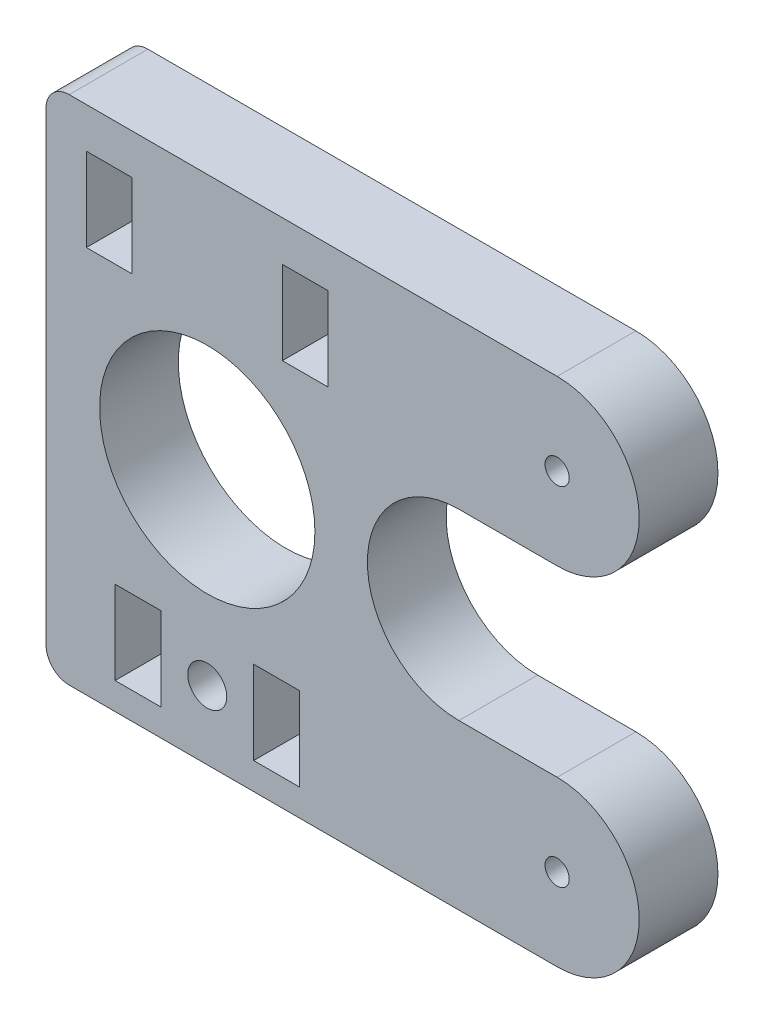
ISO-10303-21;
HEADER;
FILE_DESCRIPTION(('STEP AP214'),'2;1');
FILE_NAME('part.step','',(''),(''),'','','');
FILE_SCHEMA(('AUTOMOTIVE_DESIGN { 1 0 10303 214 1 1 1 1 }'));
ENDSEC;
DATA;
#1=APPLICATION_CONTEXT('core data for automotive mechanical design processes');
#2=APPLICATION_PROTOCOL_DEFINITION('international standard','automotive_design',2000,#1);
#3=PRODUCT_CONTEXT('',#1,'mechanical');
#4=PRODUCT('Part','Part','',(#3));
#5=PRODUCT_RELATED_PRODUCT_CATEGORY('part','',(#4));
#6=PRODUCT_DEFINITION_FORMATION('','',#4);
#7=PRODUCT_DEFINITION_CONTEXT('part definition',#1,'design');
#8=PRODUCT_DEFINITION('design','',#6,#7);
#9=PRODUCT_DEFINITION_SHAPE('','',#8);
#10=(LENGTH_UNIT() NAMED_UNIT(*) SI_UNIT(.MILLI.,.METRE.));
#11=(NAMED_UNIT(*) PLANE_ANGLE_UNIT() SI_UNIT($,.RADIAN.));
#12=(NAMED_UNIT(*) SI_UNIT($,.STERADIAN.) SOLID_ANGLE_UNIT());
#13=UNCERTAINTY_MEASURE_WITH_UNIT(LENGTH_MEASURE(1.E-05),#10,'distance_accuracy_value','');
#14=(GEOMETRIC_REPRESENTATION_CONTEXT(3) GLOBAL_UNCERTAINTY_ASSIGNED_CONTEXT((#13)) GLOBAL_UNIT_ASSIGNED_CONTEXT((#10,
#11,#12)) REPRESENTATION_CONTEXT('',''));
#15=CARTESIAN_POINT('',(0.,0.,0.));
#16=DIRECTION('',(0.,0.,1.));
#17=DIRECTION('',(1.,0.,0.));
#18=AXIS2_PLACEMENT_3D('',#15,#16,#17);
#19=CARTESIAN_POINT('',(684.72652137136,317.86545660983,5.85));
#20=DIRECTION('',(0.,0.,1.));
#21=DIRECTION('',(1.,0.,0.));
#22=AXIS2_PLACEMENT_3D('',#19,#20,#21);
#23=PLANE('',#22);
#24=DIRECTION('',(0.,1.,0.));
#25=VECTOR('',#24,1.);
#26=CARTESIAN_POINT('',(667.706532371359,340.56545660983,5.85));
#27=LINE('',#26,#25);
#28=CARTESIAN_POINT('',(667.706532371359,340.56545660983,5.85));
#29=VERTEX_POINT('',#28);
#30=CARTESIAN_POINT('',(667.706532371359,346.76545660983,5.85));
#31=VERTEX_POINT('',#30);
#32=EDGE_CURVE('E244',#29,#31,#27,.T.);
#33=ORIENTED_EDGE('',*,*,#32,.F.);
#34=DIRECTION('',(1.,0.,0.));
#35=VECTOR('',#34,1.);
#36=CARTESIAN_POINT('',(664.306521371359,340.56545660983,5.85));
#37=LINE('',#36,#35);
#38=CARTESIAN_POINT('',(664.306521371359,340.56545660983,5.85));
#39=VERTEX_POINT('',#38);
#40=EDGE_CURVE('E242',#39,#29,#37,.T.);
#41=ORIENTED_EDGE('',*,*,#40,.F.);
#42=DIRECTION('',(0.,-1.,0.));
#43=VECTOR('',#42,1.);
#44=CARTESIAN_POINT('',(664.306521371359,346.76545660983,5.85));
#45=LINE('',#44,#43);
#46=CARTESIAN_POINT('',(664.306521371359,346.76545660983,5.85));
#47=VERTEX_POINT('',#46);
#48=EDGE_CURVE('E250',#47,#39,#45,.T.);
#49=ORIENTED_EDGE('',*,*,#48,.F.);
#50=DIRECTION('',(-1.,0.,0.));
#51=VECTOR('',#50,1.);
#52=CARTESIAN_POINT('',(667.706532371359,346.76545660983,5.85));
#53=LINE('',#52,#51);
#54=EDGE_CURVE('E247',#31,#47,#53,.T.);
#55=ORIENTED_EDGE('',*,*,#54,.F.);
#56=EDGE_LOOP('',(#33,#41,#49,#55));
#57=FACE_BOUND('',#56,.T.);
#58=DIRECTION('',(0.,1.,0.));
#59=VECTOR('',#58,1.);
#60=CARTESIAN_POINT('',(653.146521371359,340.56545660983,5.85));
#61=LINE('',#60,#59);
#62=CARTESIAN_POINT('',(653.146521371359,340.56545660983,5.85));
#63=VERTEX_POINT('',#62);
#64=CARTESIAN_POINT('',(653.146521371359,346.76545660983,5.85));
#65=VERTEX_POINT('',#64);
#66=EDGE_CURVE('E306',#63,#65,#61,.T.);
#67=ORIENTED_EDGE('',*,*,#66,.F.);
#68=DIRECTION('',(1.,0.,0.));
#69=VECTOR('',#68,1.);
#70=CARTESIAN_POINT('',(649.746510371359,340.56545660983,5.85));
#71=LINE('',#70,#69);
#72=CARTESIAN_POINT('',(649.746510371359,340.56545660983,5.85));
#73=VERTEX_POINT('',#72);
#74=EDGE_CURVE('E304',#73,#63,#71,.T.);
#75=ORIENTED_EDGE('',*,*,#74,.F.);
#76=DIRECTION('',(0.,-1.,0.));
#77=VECTOR('',#76,1.);
#78=CARTESIAN_POINT('',(649.746510371359,346.76545660983,5.85));
#79=LINE('',#78,#77);
#80=CARTESIAN_POINT('',(649.746510371359,346.76545660983,5.85));
#81=VERTEX_POINT('',#80);
#82=EDGE_CURVE('E312',#81,#73,#79,.T.);
#83=ORIENTED_EDGE('',*,*,#82,.F.);
#84=DIRECTION('',(-1.,0.,0.));
#85=VECTOR('',#84,1.);
#86=CARTESIAN_POINT('',(653.146521371359,346.76545660983,5.85));
#87=LINE('',#86,#85);
#88=EDGE_CURVE('E309',#65,#81,#87,.T.);
#89=ORIENTED_EDGE('',*,*,#88,.F.);
#90=EDGE_LOOP('',(#67,#75,#83,#89));
#91=FACE_BOUND('',#90,.T.);
#92=CARTESIAN_POINT('',(658.72652137136,330.76545660983,5.85));
#93=DIRECTION('',(0.,0.,1.));
#94=DIRECTION('',(1.,0.,0.));
#95=AXIS2_PLACEMENT_3D('',#92,#93,#94);
#96=CIRCLE('',#95,7.99999999999999);
#97=CARTESIAN_POINT('',(666.72652137136,330.76545660983,5.85));
#98=VERTEX_POINT('',#97);
#99=EDGE_CURVE('E341',#98,#98,#96,.T.);
#100=ORIENTED_EDGE('',*,*,#99,.F.);
#101=EDGE_LOOP('',(#100));
#102=FACE_BOUND('',#101,.T.);
#103=CARTESIAN_POINT('',(684.72652137136,343.66545660983,5.85));
#104=DIRECTION('',(0.,0.,1.));
#105=DIRECTION('',(1.,0.,0.));
#106=AXIS2_PLACEMENT_3D('',#103,#104,#105);
#107=CIRCLE('',#106,0.900000000000007);
#108=CARTESIAN_POINT('',(685.62652137136,343.66545660983,5.85));
#109=VERTEX_POINT('',#108);
#110=EDGE_CURVE('E353',#109,#109,#107,.T.);
#111=ORIENTED_EDGE('',*,*,#110,.F.);
#112=EDGE_LOOP('',(#111));
#113=FACE_BOUND('',#112,.T.);
#114=DIRECTION('',(1.,0.,0.));
#115=VECTOR('',#114,1.);
#116=CARTESIAN_POINT('',(669.216844170211,311.76545660983,5.85));
#117=LINE('',#116,#115);
#118=CARTESIAN_POINT('',(648.463811899795,311.76545660983,5.85));
#119=VERTEX_POINT('',#118);
#120=CARTESIAN_POINT('',(684.72652137136,311.76545660983,5.85));
#121=VERTEX_POINT('',#120);
#122=EDGE_CURVE('E359',#119,#121,#117,.T.);
#123=ORIENTED_EDGE('',*,*,#122,.T.);
#124=CARTESIAN_POINT('',(684.72652137136,317.86545660983,5.85));
#125=DIRECTION('',(0.,0.,1.));
#126=DIRECTION('',(1.,0.,0.));
#127=AXIS2_PLACEMENT_3D('',#124,#125,#126);
#128=CIRCLE('',#127,6.10000000000002);
#129=CARTESIAN_POINT('',(684.72652137136,323.96545660983,5.85));
#130=VERTEX_POINT('',#129);
#131=EDGE_CURVE('E362',#121,#130,#128,.T.);
#132=ORIENTED_EDGE('',*,*,#131,.T.);
#133=DIRECTION('',(-1.,0.,0.));
#134=VECTOR('',#133,1.);
#135=CARTESIAN_POINT('',(684.72652137136,323.96545660983,5.85));
#136=LINE('',#135,#134);
#137=CARTESIAN_POINT('',(677.426521371358,323.96545660983,5.85));
#138=VERTEX_POINT('',#137);
#139=EDGE_CURVE('E365',#130,#138,#136,.T.);
#140=ORIENTED_EDGE('',*,*,#139,.T.);
#141=CARTESIAN_POINT('',(677.426521371358,330.76545660983,5.85));
#142=DIRECTION('',(0.,0.,-1.));
#143=DIRECTION('',(1.,0.,0.));
#144=AXIS2_PLACEMENT_3D('',#141,#142,#143);
#145=CIRCLE('',#144,6.80000000000008);
#146=CARTESIAN_POINT('',(677.426521371358,337.56545660983,5.85));
#147=VERTEX_POINT('',#146);
#148=EDGE_CURVE('E367',#138,#147,#145,.T.);
#149=ORIENTED_EDGE('',*,*,#148,.T.);
#150=DIRECTION('',(1.,0.,0.));
#151=VECTOR('',#150,1.);
#152=CARTESIAN_POINT('',(684.72652137136,337.56545660983,5.85));
#153=LINE('',#152,#151);
#154=CARTESIAN_POINT('',(684.72652137136,337.56545660983,5.85));
#155=VERTEX_POINT('',#154);
#156=EDGE_CURVE('E369',#147,#155,#153,.T.);
#157=ORIENTED_EDGE('',*,*,#156,.T.);
#158=CARTESIAN_POINT('',(684.72652137136,343.66545660983,5.85));
#159=DIRECTION('',(0.,0.,1.));
#160=DIRECTION('',(-1.,0.,0.));
#161=AXIS2_PLACEMENT_3D('',#158,#159,#160);
#162=CIRCLE('',#161,6.0999999999998);
#163=CARTESIAN_POINT('',(684.72652137136,349.76545660983,5.85));
#164=VERTEX_POINT('',#163);
#165=EDGE_CURVE('E371',#155,#164,#162,.T.);
#166=ORIENTED_EDGE('',*,*,#165,.T.);
#167=DIRECTION('',(-1.,0.,0.));
#168=VECTOR('',#167,1.);
#169=CARTESIAN_POINT('',(669.216844170209,349.76545660983,5.85));
#170=LINE('',#169,#168);
#171=CARTESIAN_POINT('',(648.463811899795,349.76545660983,5.85));
#172=VERTEX_POINT('',#171);
#173=EDGE_CURVE('E373',#164,#172,#170,.T.);
#174=ORIENTED_EDGE('',*,*,#173,.T.);
#175=CARTESIAN_POINT('',(648.463811899795,348.048155081394,5.85));
#176=DIRECTION('',(0.,0.,1.));
#177=DIRECTION('',(1.,0.,0.));
#178=AXIS2_PLACEMENT_3D('',#175,#176,#177);
#179=CIRCLE('',#178,1.71730152843572);
#180=CARTESIAN_POINT('',(646.746510371359,348.048155081394,5.85));
#181=VERTEX_POINT('',#180);
#182=EDGE_CURVE('E375',#172,#181,#179,.T.);
#183=ORIENTED_EDGE('',*,*,#182,.T.);
#184=DIRECTION('',(0.,-1.,0.));
#185=VECTOR('',#184,1.);
#186=CARTESIAN_POINT('',(646.746510371359,348.048155081394,5.85));
#187=LINE('',#186,#185);
#188=CARTESIAN_POINT('',(646.746510371359,313.482758138266,5.85));
#189=VERTEX_POINT('',#188);
#190=EDGE_CURVE('E377',#181,#189,#187,.T.);
#191=ORIENTED_EDGE('',*,*,#190,.T.);
#192=CARTESIAN_POINT('',(648.463811899795,313.482758138266,5.85));
#193=DIRECTION('',(0.,0.,1.));
#194=DIRECTION('',(1.,0.,0.));
#195=AXIS2_PLACEMENT_3D('',#192,#193,#194);
#196=CIRCLE('',#195,1.71730152843572);
#197=EDGE_CURVE('E379',#189,#119,#196,.T.);
#198=ORIENTED_EDGE('',*,*,#197,.T.);
#199=EDGE_LOOP('',(#123,#132,#140,#149,#157,#166,#174,#183,#191,#198));
#200=FACE_BOUND('',#199,.T.);
#201=CARTESIAN_POINT('',(658.726521371359,316.86545660983,5.85));
#202=DIRECTION('',(0.,0.,1.));
#203=DIRECTION('',(1.,0.,0.));
#204=AXIS2_PLACEMENT_3D('',#201,#202,#203);
#205=CIRCLE('',#204,1.44999999999994);
#206=CARTESIAN_POINT('',(660.176521371359,316.86545660983,5.85));
#207=VERTEX_POINT('',#206);
#208=EDGE_CURVE('E347',#207,#207,#205,.T.);
#209=ORIENTED_EDGE('',*,*,#208,.F.);
#210=EDGE_LOOP('',(#209));
#211=FACE_BOUND('',#210,.T.);
#212=CARTESIAN_POINT('',(684.72652137136,317.86545660983,5.85));
#213=DIRECTION('',(0.,0.,1.));
#214=DIRECTION('',(1.,0.,0.));
#215=AXIS2_PLACEMENT_3D('',#212,#213,#214);
#216=CIRCLE('',#215,0.900000000000007);
#217=CARTESIAN_POINT('',(685.62652137136,317.86545660983,5.85));
#218=VERTEX_POINT('',#217);
#219=EDGE_CURVE('E335',#218,#218,#216,.T.);
#220=ORIENTED_EDGE('',*,*,#219,.F.);
#221=EDGE_LOOP('',(#220));
#222=FACE_BOUND('',#221,.T.);
#223=DIRECTION('',(1.,0.,0.));
#224=VECTOR('',#223,1.);
#225=CARTESIAN_POINT('',(651.87652137136,313.76545660983,5.85));
#226=LINE('',#225,#224);
#227=CARTESIAN_POINT('',(651.87652137136,313.76545660983,5.85));
#228=VERTEX_POINT('',#227);
#229=CARTESIAN_POINT('',(655.276521371359,313.76545660983,5.85));
#230=VERTEX_POINT('',#229);
#231=EDGE_CURVE('E275',#228,#230,#226,.T.);
#232=ORIENTED_EDGE('',*,*,#231,.F.);
#233=DIRECTION('',(0.,-1.,0.));
#234=VECTOR('',#233,1.);
#235=CARTESIAN_POINT('',(651.87652137136,319.96545660983,5.85));
#236=LINE('',#235,#234);
#237=CARTESIAN_POINT('',(651.87652137136,319.96545660983,5.85));
#238=VERTEX_POINT('',#237);
#239=EDGE_CURVE('E273',#238,#228,#236,.T.);
#240=ORIENTED_EDGE('',*,*,#239,.F.);
#241=DIRECTION('',(-1.,0.,0.));
#242=VECTOR('',#241,1.);
#243=CARTESIAN_POINT('',(655.276521371359,319.96545660983,5.85));
#244=LINE('',#243,#242);
#245=CARTESIAN_POINT('',(655.276521371359,319.96545660983,5.85));
#246=VERTEX_POINT('',#245);
#247=EDGE_CURVE('E281',#246,#238,#244,.T.);
#248=ORIENTED_EDGE('',*,*,#247,.F.);
#249=DIRECTION('',(0.,1.,0.));
#250=VECTOR('',#249,1.);
#251=CARTESIAN_POINT('',(655.276521371359,313.76545660983,5.85));
#252=LINE('',#251,#250);
#253=EDGE_CURVE('E278',#230,#246,#252,.T.);
#254=ORIENTED_EDGE('',*,*,#253,.F.);
#255=EDGE_LOOP('',(#232,#240,#248,#254));
#256=FACE_BOUND('',#255,.T.);
#257=DIRECTION('',(0.,-1.,0.));
#258=VECTOR('',#257,1.);
#259=CARTESIAN_POINT('',(662.176521371361,319.96545660983,5.85));
#260=LINE('',#259,#258);
#261=CARTESIAN_POINT('',(662.176521371361,319.96545660983,5.85));
#262=VERTEX_POINT('',#261);
#263=CARTESIAN_POINT('',(662.176521371361,313.76545660983,5.85));
#264=VERTEX_POINT('',#263);
#265=EDGE_CURVE('E214',#262,#264,#260,.T.);
#266=ORIENTED_EDGE('',*,*,#265,.F.);
#267=DIRECTION('',(-1.,0.,0.));
#268=VECTOR('',#267,1.);
#269=CARTESIAN_POINT('',(665.576521371361,319.96545660983,5.85));
#270=LINE('',#269,#268);
#271=CARTESIAN_POINT('',(665.576521371361,319.96545660983,5.85));
#272=VERTEX_POINT('',#271);
#273=EDGE_CURVE('E206',#272,#262,#270,.T.);
#274=ORIENTED_EDGE('',*,*,#273,.F.);
#275=DIRECTION('',(0.,1.,0.));
#276=VECTOR('',#275,1.);
#277=CARTESIAN_POINT('',(665.576521371361,313.76545660983,5.85));
#278=LINE('',#277,#276);
#279=CARTESIAN_POINT('',(665.576521371361,313.76545660983,5.85));
#280=VERTEX_POINT('',#279);
#281=EDGE_CURVE('E228',#280,#272,#278,.T.);
#282=ORIENTED_EDGE('',*,*,#281,.F.);
#283=DIRECTION('',(1.,0.,0.));
#284=VECTOR('',#283,1.);
#285=CARTESIAN_POINT('',(662.176521371361,313.76545660983,5.85));
#286=LINE('',#285,#284);
#287=EDGE_CURVE('E226',#264,#280,#286,.T.);
#288=ORIENTED_EDGE('',*,*,#287,.F.);
#289=EDGE_LOOP('',(#266,#274,#282,#288));
#290=FACE_BOUND('',#289,.T.);
#291=ADVANCED_FACE('F33',(#57,#91,#102,#113,#200,#211,#222,#256,#290),#23,.T.);
#292=CARTESIAN_POINT('',(684.72652137136,317.86545660983,0.));
#293=DIRECTION('',(0.,0.,1.));
#294=DIRECTION('',(1.,0.,0.));
#295=AXIS2_PLACEMENT_3D('',#292,#293,#294);
#296=PLANE('',#295);
#297=DIRECTION('',(1.,0.,0.));
#298=VECTOR('',#297,1.);
#299=CARTESIAN_POINT('',(664.306521371359,340.56545660983,0.));
#300=LINE('',#299,#298);
#301=CARTESIAN_POINT('',(664.306521371359,340.56545660983,0.));
#302=VERTEX_POINT('',#301);
#303=CARTESIAN_POINT('',(667.706532371359,340.56545660983,0.));
#304=VERTEX_POINT('',#303);
#305=EDGE_CURVE('E222',#302,#304,#300,.T.);
#306=ORIENTED_EDGE('',*,*,#305,.T.);
#307=DIRECTION('',(0.,1.,0.));
#308=VECTOR('',#307,1.);
#309=CARTESIAN_POINT('',(667.706532371359,340.56545660983,0.));
#310=LINE('',#309,#308);
#311=CARTESIAN_POINT('',(667.706532371359,346.76545660983,0.));
#312=VERTEX_POINT('',#311);
#313=EDGE_CURVE('E255',#304,#312,#310,.T.);
#314=ORIENTED_EDGE('',*,*,#313,.T.);
#315=DIRECTION('',(-1.,0.,0.));
#316=VECTOR('',#315,1.);
#317=CARTESIAN_POINT('',(667.706532371359,346.76545660983,0.));
#318=LINE('',#317,#316);
#319=CARTESIAN_POINT('',(664.306521371359,346.76545660983,0.));
#320=VERTEX_POINT('',#319);
#321=EDGE_CURVE('E258',#312,#320,#318,.T.);
#322=ORIENTED_EDGE('',*,*,#321,.T.);
#323=DIRECTION('',(0.,-1.,0.));
#324=VECTOR('',#323,1.);
#325=CARTESIAN_POINT('',(664.306521371359,346.76545660983,0.));
#326=LINE('',#325,#324);
#327=EDGE_CURVE('E245',#320,#302,#326,.T.);
#328=ORIENTED_EDGE('',*,*,#327,.T.);
#329=EDGE_LOOP('',(#306,#314,#322,#328));
#330=FACE_BOUND('',#329,.T.);
#331=DIRECTION('',(1.,0.,0.));
#332=VECTOR('',#331,1.);
#333=CARTESIAN_POINT('',(649.746510371359,340.56545660983,0.));
#334=LINE('',#333,#332);
#335=CARTESIAN_POINT('',(649.746510371359,340.56545660983,0.));
#336=VERTEX_POINT('',#335);
#337=CARTESIAN_POINT('',(653.146521371359,340.56545660983,0.));
#338=VERTEX_POINT('',#337);
#339=EDGE_CURVE('E303',#336,#338,#334,.T.);
#340=ORIENTED_EDGE('',*,*,#339,.T.);
#341=DIRECTION('',(0.,1.,0.));
#342=VECTOR('',#341,1.);
#343=CARTESIAN_POINT('',(653.146521371359,340.56545660983,0.));
#344=LINE('',#343,#342);
#345=CARTESIAN_POINT('',(653.146521371359,346.76545660983,0.));
#346=VERTEX_POINT('',#345);
#347=EDGE_CURVE('E317',#338,#346,#344,.T.);
#348=ORIENTED_EDGE('',*,*,#347,.T.);
#349=DIRECTION('',(-1.,0.,0.));
#350=VECTOR('',#349,1.);
#351=CARTESIAN_POINT('',(653.146521371359,346.76545660983,0.));
#352=LINE('',#351,#350);
#353=CARTESIAN_POINT('',(649.746510371359,346.76545660983,0.));
#354=VERTEX_POINT('',#353);
#355=EDGE_CURVE('E320',#346,#354,#352,.T.);
#356=ORIENTED_EDGE('',*,*,#355,.T.);
#357=DIRECTION('',(0.,-1.,0.));
#358=VECTOR('',#357,1.);
#359=CARTESIAN_POINT('',(649.746510371359,346.76545660983,0.));
#360=LINE('',#359,#358);
#361=EDGE_CURVE('E307',#354,#336,#360,.T.);
#362=ORIENTED_EDGE('',*,*,#361,.T.);
#363=EDGE_LOOP('',(#340,#348,#356,#362));
#364=FACE_BOUND('',#363,.T.);
#365=CARTESIAN_POINT('',(658.72652137136,330.76545660983,0.));
#366=DIRECTION('',(0.,0.,1.));
#367=DIRECTION('',(1.,0.,0.));
#368=AXIS2_PLACEMENT_3D('',#365,#366,#367);
#369=CIRCLE('',#368,7.99999999999999);
#370=CARTESIAN_POINT('',(666.72652137136,330.76545660983,0.));
#371=VERTEX_POINT('',#370);
#372=EDGE_CURVE('E338',#371,#371,#369,.T.);
#373=ORIENTED_EDGE('',*,*,#372,.T.);
#374=EDGE_LOOP('',(#373));
#375=FACE_BOUND('',#374,.T.);
#376=CARTESIAN_POINT('',(684.72652137136,343.66545660983,0.));
#377=DIRECTION('',(0.,0.,1.));
#378=DIRECTION('',(1.,0.,0.));
#379=AXIS2_PLACEMENT_3D('',#376,#377,#378);
#380=CIRCLE('',#379,0.900000000000007);
#381=CARTESIAN_POINT('',(685.62652137136,343.66545660983,0.));
#382=VERTEX_POINT('',#381);
#383=EDGE_CURVE('E350',#382,#382,#380,.T.);
#384=ORIENTED_EDGE('',*,*,#383,.T.);
#385=EDGE_LOOP('',(#384));
#386=FACE_BOUND('',#385,.T.);
#387=CARTESIAN_POINT('',(684.72652137136,317.86545660983,0.));
#388=DIRECTION('',(0.,0.,1.));
#389=DIRECTION('',(1.,0.,0.));
#390=AXIS2_PLACEMENT_3D('',#387,#388,#389);
#391=CIRCLE('',#390,6.10000000000002);
#392=CARTESIAN_POINT('',(684.72652137136,311.76545660983,0.));
#393=VERTEX_POINT('',#392);
#394=CARTESIAN_POINT('',(684.72652137136,323.96545660983,0.));
#395=VERTEX_POINT('',#394);
#396=EDGE_CURVE('E356',#393,#395,#391,.T.);
#397=ORIENTED_EDGE('',*,*,#396,.F.);
#398=DIRECTION('',(1.,0.,0.));
#399=VECTOR('',#398,1.);
#400=CARTESIAN_POINT('',(648.463811899795,311.76545660983,0.));
#401=LINE('',#400,#399);
#402=CARTESIAN_POINT('',(648.463811899795,311.76545660983,0.));
#403=VERTEX_POINT('',#402);
#404=EDGE_CURVE('E363',#403,#393,#401,.T.);
#405=ORIENTED_EDGE('',*,*,#404,.F.);
#406=CARTESIAN_POINT('',(648.463811899795,313.482758138266,0.));
#407=DIRECTION('',(0.,0.,1.));
#408=DIRECTION('',(1.,0.,0.));
#409=AXIS2_PLACEMENT_3D('',#406,#407,#408);
#410=CIRCLE('',#409,1.71730152843572);
#411=CARTESIAN_POINT('',(646.746510371359,313.482758138266,0.));
#412=VERTEX_POINT('',#411);
#413=EDGE_CURVE('E399',#412,#403,#410,.T.);
#414=ORIENTED_EDGE('',*,*,#413,.F.);
#415=DIRECTION('',(0.,-1.,0.));
#416=VECTOR('',#415,1.);
#417=CARTESIAN_POINT('',(646.746510371359,348.048155081394,0.));
#418=LINE('',#417,#416);
#419=CARTESIAN_POINT('',(646.746510371359,348.048155081394,0.));
#420=VERTEX_POINT('',#419);
#421=EDGE_CURVE('E397',#420,#412,#418,.T.);
#422=ORIENTED_EDGE('',*,*,#421,.F.);
#423=CARTESIAN_POINT('',(648.463811899795,348.048155081394,0.));
#424=DIRECTION('',(0.,0.,1.));
#425=DIRECTION('',(1.,0.,0.));
#426=AXIS2_PLACEMENT_3D('',#423,#424,#425);
#427=CIRCLE('',#426,1.71730152843572);
#428=CARTESIAN_POINT('',(648.463811899795,349.76545660983,0.));
#429=VERTEX_POINT('',#428);
#430=EDGE_CURVE('E395',#429,#420,#427,.T.);
#431=ORIENTED_EDGE('',*,*,#430,.F.);
#432=DIRECTION('',(-1.,0.,0.));
#433=VECTOR('',#432,1.);
#434=CARTESIAN_POINT('',(669.216844170209,349.76545660983,0.));
#435=LINE('',#434,#433);
#436=CARTESIAN_POINT('',(684.72652137136,349.76545660983,0.));
#437=VERTEX_POINT('',#436);
#438=EDGE_CURVE('E393',#437,#429,#435,.T.);
#439=ORIENTED_EDGE('',*,*,#438,.F.);
#440=CARTESIAN_POINT('',(684.72652137136,343.66545660983,0.));
#441=DIRECTION('',(0.,0.,1.));
#442=DIRECTION('',(-1.,0.,0.));
#443=AXIS2_PLACEMENT_3D('',#440,#441,#442);
#444=CIRCLE('',#443,6.0999999999998);
#445=CARTESIAN_POINT('',(684.72652137136,337.56545660983,0.));
#446=VERTEX_POINT('',#445);
#447=EDGE_CURVE('E390',#446,#437,#444,.T.);
#448=ORIENTED_EDGE('',*,*,#447,.F.);
#449=DIRECTION('',(1.,0.,0.));
#450=VECTOR('',#449,1.);
#451=CARTESIAN_POINT('',(684.72652137136,337.56545660983,0.));
#452=LINE('',#451,#450);
#453=CARTESIAN_POINT('',(677.426521371358,337.56545660983,0.));
#454=VERTEX_POINT('',#453);
#455=EDGE_CURVE('E388',#454,#446,#452,.T.);
#456=ORIENTED_EDGE('',*,*,#455,.F.);
#457=CARTESIAN_POINT('',(677.426521371358,330.76545660983,0.));
#458=DIRECTION('',(0.,0.,-1.));
#459=DIRECTION('',(1.,0.,0.));
#460=AXIS2_PLACEMENT_3D('',#457,#458,#459);
#461=CIRCLE('',#460,6.80000000000008);
#462=CARTESIAN_POINT('',(677.426521371358,323.96545660983,0.));
#463=VERTEX_POINT('',#462);
#464=EDGE_CURVE('E386',#463,#454,#461,.T.);
#465=ORIENTED_EDGE('',*,*,#464,.F.);
#466=DIRECTION('',(-1.,0.,0.));
#467=VECTOR('',#466,1.);
#468=CARTESIAN_POINT('',(684.72652137136,323.96545660983,0.));
#469=LINE('',#468,#467);
#470=EDGE_CURVE('E384',#395,#463,#469,.T.);
#471=ORIENTED_EDGE('',*,*,#470,.F.);
#472=EDGE_LOOP('',(#397,#405,#414,#422,#431,#439,#448,#456,#465,#471));
#473=FACE_BOUND('',#472,.T.);
#474=CARTESIAN_POINT('',(658.726521371359,316.86545660983,0.));
#475=DIRECTION('',(0.,0.,1.));
#476=DIRECTION('',(1.,0.,0.));
#477=AXIS2_PLACEMENT_3D('',#474,#475,#476);
#478=CIRCLE('',#477,1.44999999999994);
#479=CARTESIAN_POINT('',(660.176521371359,316.86545660983,0.));
#480=VERTEX_POINT('',#479);
#481=EDGE_CURVE('E344',#480,#480,#478,.T.);
#482=ORIENTED_EDGE('',*,*,#481,.T.);
#483=EDGE_LOOP('',(#482));
#484=FACE_BOUND('',#483,.T.);
#485=CARTESIAN_POINT('',(684.72652137136,317.86545660983,0.));
#486=DIRECTION('',(0.,0.,1.));
#487=DIRECTION('',(1.,0.,0.));
#488=AXIS2_PLACEMENT_3D('',#485,#486,#487);
#489=CIRCLE('',#488,0.900000000000007);
#490=CARTESIAN_POINT('',(685.62652137136,317.86545660983,0.));
#491=VERTEX_POINT('',#490);
#492=EDGE_CURVE('E334',#491,#491,#489,.T.);
#493=ORIENTED_EDGE('',*,*,#492,.T.);
#494=EDGE_LOOP('',(#493));
#495=FACE_BOUND('',#494,.T.);
#496=DIRECTION('',(0.,-1.,0.));
#497=VECTOR('',#496,1.);
#498=CARTESIAN_POINT('',(651.87652137136,319.96545660983,0.));
#499=LINE('',#498,#497);
#500=CARTESIAN_POINT('',(651.87652137136,319.96545660983,0.));
#501=VERTEX_POINT('',#500);
#502=CARTESIAN_POINT('',(651.87652137136,313.76545660983,0.));
#503=VERTEX_POINT('',#502);
#504=EDGE_CURVE('E272',#501,#503,#499,.T.);
#505=ORIENTED_EDGE('',*,*,#504,.T.);
#506=DIRECTION('',(1.,0.,0.));
#507=VECTOR('',#506,1.);
#508=CARTESIAN_POINT('',(651.87652137136,313.76545660983,0.));
#509=LINE('',#508,#507);
#510=CARTESIAN_POINT('',(655.276521371359,313.76545660983,0.));
#511=VERTEX_POINT('',#510);
#512=EDGE_CURVE('E286',#503,#511,#509,.T.);
#513=ORIENTED_EDGE('',*,*,#512,.T.);
#514=DIRECTION('',(0.,1.,0.));
#515=VECTOR('',#514,1.);
#516=CARTESIAN_POINT('',(655.276521371359,313.76545660983,0.));
#517=LINE('',#516,#515);
#518=CARTESIAN_POINT('',(655.276521371359,319.96545660983,0.));
#519=VERTEX_POINT('',#518);
#520=EDGE_CURVE('E289',#511,#519,#517,.T.);
#521=ORIENTED_EDGE('',*,*,#520,.T.);
#522=DIRECTION('',(-1.,0.,0.));
#523=VECTOR('',#522,1.);
#524=CARTESIAN_POINT('',(655.276521371359,319.96545660983,0.));
#525=LINE('',#524,#523);
#526=EDGE_CURVE('E276',#519,#501,#525,.T.);
#527=ORIENTED_EDGE('',*,*,#526,.T.);
#528=EDGE_LOOP('',(#505,#513,#521,#527));
#529=FACE_BOUND('',#528,.T.);
#530=DIRECTION('',(-1.,0.,0.));
#531=VECTOR('',#530,1.);
#532=CARTESIAN_POINT('',(665.576521371361,319.96545660983,0.));
#533=LINE('',#532,#531);
#534=CARTESIAN_POINT('',(665.576521371361,319.96545660983,0.));
#535=VERTEX_POINT('',#534);
#536=CARTESIAN_POINT('',(662.176521371361,319.96545660983,0.));
#537=VERTEX_POINT('',#536);
#538=EDGE_CURVE('E56',#535,#537,#533,.T.);
#539=ORIENTED_EDGE('',*,*,#538,.T.);
#540=DIRECTION('',(0.,-1.,0.));
#541=VECTOR('',#540,1.);
#542=CARTESIAN_POINT('',(662.176521371361,319.96545660983,0.));
#543=LINE('',#542,#541);
#544=CARTESIAN_POINT('',(662.176521371361,313.76545660983,0.));
#545=VERTEX_POINT('',#544);
#546=EDGE_CURVE('E221',#537,#545,#543,.T.);
#547=ORIENTED_EDGE('',*,*,#546,.T.);
#548=DIRECTION('',(1.,0.,0.));
#549=VECTOR('',#548,1.);
#550=CARTESIAN_POINT('',(662.176521371361,313.76545660983,0.));
#551=LINE('',#550,#549);
#552=CARTESIAN_POINT('',(665.576521371361,313.76545660983,0.));
#553=VERTEX_POINT('',#552);
#554=EDGE_CURVE('E234',#545,#553,#551,.T.);
#555=ORIENTED_EDGE('',*,*,#554,.T.);
#556=DIRECTION('',(0.,1.,0.));
#557=VECTOR('',#556,1.);
#558=CARTESIAN_POINT('',(665.576521371361,313.76545660983,0.));
#559=LINE('',#558,#557);
#560=EDGE_CURVE('E215',#553,#535,#559,.T.);
#561=ORIENTED_EDGE('',*,*,#560,.T.);
#562=EDGE_LOOP('',(#539,#547,#555,#561));
#563=FACE_BOUND('',#562,.T.);
#564=ADVANCED_FACE('F435',(#330,#364,#375,#386,#473,#484,#495,#529,#563),#296,.F.);
#565=CARTESIAN_POINT('',(684.72652137136,317.86545660983,5.85));
#566=DIRECTION('',(0.,0.,-1.));
#567=DIRECTION('',(-1.,0.,0.));
#568=AXIS2_PLACEMENT_3D('',#565,#566,#567);
#569=CYLINDRICAL_SURFACE('',#568,6.10000000000002);
#570=ORIENTED_EDGE('',*,*,#396,.T.);
#571=DIRECTION('',(0.,0.,-1.));
#572=VECTOR('',#571,1.);
#573=CARTESIAN_POINT('',(684.72652137136,323.96545660983,5.85));
#574=LINE('',#573,#572);
#575=EDGE_CURVE('E41',#130,#395,#574,.T.);
#576=ORIENTED_EDGE('',*,*,#575,.F.);
#577=ORIENTED_EDGE('',*,*,#131,.F.);
#578=DIRECTION('',(0.,0.,-1.));
#579=VECTOR('',#578,1.);
#580=CARTESIAN_POINT('',(684.72652137136,311.76545660983,5.85));
#581=LINE('',#580,#579);
#582=EDGE_CURVE('E11',#121,#393,#581,.T.);
#583=ORIENTED_EDGE('',*,*,#582,.T.);
#584=EDGE_LOOP('',(#570,#576,#577,#583));
#585=FACE_BOUND('',#584,.T.);
#586=ADVANCED_FACE('F35',(#585),#569,.T.);
#587=CARTESIAN_POINT('',(684.72652137136,323.96545660983,5.85));
#588=DIRECTION('',(0.,-1.,0.));
#589=DIRECTION('',(1.,0.,0.));
#590=AXIS2_PLACEMENT_3D('',#587,#588,#589);
#591=PLANE('',#590);
#592=ORIENTED_EDGE('',*,*,#470,.T.);
#593=DIRECTION('',(0.,0.,-1.));
#594=VECTOR('',#593,1.);
#595=CARTESIAN_POINT('',(677.426521371358,323.96545660983,5.85));
#596=LINE('',#595,#594);
#597=EDGE_CURVE('E422',#138,#463,#596,.T.);
#598=ORIENTED_EDGE('',*,*,#597,.F.);
#599=ORIENTED_EDGE('',*,*,#139,.F.);
#600=ORIENTED_EDGE('',*,*,#575,.T.);
#601=EDGE_LOOP('',(#592,#598,#599,#600));
#602=FACE_BOUND('',#601,.T.);
#603=ADVANCED_FACE('F429',(#602),#591,.F.);
#604=CARTESIAN_POINT('',(677.426521371358,330.76545660983,5.85));
#605=DIRECTION('',(0.,0.,-1.));
#606=DIRECTION('',(-1.,0.,0.));
#607=AXIS2_PLACEMENT_3D('',#604,#605,#606);
#608=CYLINDRICAL_SURFACE('',#607,6.80000000000008);
#609=ORIENTED_EDGE('',*,*,#464,.T.);
#610=DIRECTION('',(0.,0.,-1.));
#611=VECTOR('',#610,1.);
#612=CARTESIAN_POINT('',(677.426521371358,337.56545660983,5.85));
#613=LINE('',#612,#611);
#614=EDGE_CURVE('E419',#147,#454,#613,.T.);
#615=ORIENTED_EDGE('',*,*,#614,.F.);
#616=ORIENTED_EDGE('',*,*,#148,.F.);
#617=ORIENTED_EDGE('',*,*,#597,.T.);
#618=EDGE_LOOP('',(#609,#615,#616,#617));
#619=FACE_BOUND('',#618,.T.);
#620=ADVANCED_FACE('F442',(#619),#608,.F.);
#621=CARTESIAN_POINT('',(684.72652137136,337.56545660983,5.85));
#622=DIRECTION('',(0.,1.,0.));
#623=DIRECTION('',(-1.,0.,0.));
#624=AXIS2_PLACEMENT_3D('',#621,#622,#623);
#625=PLANE('',#624);
#626=ORIENTED_EDGE('',*,*,#455,.T.);
#627=DIRECTION('',(0.,0.,-1.));
#628=VECTOR('',#627,1.);
#629=CARTESIAN_POINT('',(684.72652137136,337.56545660983,5.85));
#630=LINE('',#629,#628);
#631=EDGE_CURVE('E416',#155,#446,#630,.T.);
#632=ORIENTED_EDGE('',*,*,#631,.F.);
#633=ORIENTED_EDGE('',*,*,#156,.F.);
#634=ORIENTED_EDGE('',*,*,#614,.T.);
#635=EDGE_LOOP('',(#626,#632,#633,#634));
#636=FACE_BOUND('',#635,.T.);
#637=ADVANCED_FACE('F446',(#636),#625,.F.);
#638=CARTESIAN_POINT('',(684.72652137136,343.66545660983,5.85));
#639=DIRECTION('',(0.,0.,-1.));
#640=DIRECTION('',(-1.,0.,0.));
#641=AXIS2_PLACEMENT_3D('',#638,#639,#640);
#642=CYLINDRICAL_SURFACE('',#641,6.0999999999998);
#643=ORIENTED_EDGE('',*,*,#447,.T.);
#644=DIRECTION('',(0.,0.,-1.));
#645=VECTOR('',#644,1.);
#646=CARTESIAN_POINT('',(684.72652137136,349.76545660983,5.85));
#647=LINE('',#646,#645);
#648=EDGE_CURVE('E413',#164,#437,#647,.T.);
#649=ORIENTED_EDGE('',*,*,#648,.F.);
#650=ORIENTED_EDGE('',*,*,#165,.F.);
#651=ORIENTED_EDGE('',*,*,#631,.T.);
#652=EDGE_LOOP('',(#643,#649,#650,#651));
#653=FACE_BOUND('',#652,.T.);
#654=ADVANCED_FACE('F473',(#653),#642,.T.);
#655=CARTESIAN_POINT('',(669.216844170209,349.76545660983,5.85));
#656=DIRECTION('',(0.,-1.,0.));
#657=DIRECTION('',(0.,0.,-1.));
#658=AXIS2_PLACEMENT_3D('',#655,#656,#657);
#659=PLANE('',#658);
#660=ORIENTED_EDGE('',*,*,#438,.T.);
#661=DIRECTION('',(0.,0.,-1.));
#662=VECTOR('',#661,1.);
#663=CARTESIAN_POINT('',(648.463811899795,349.76545660983,5.85));
#664=LINE('',#663,#662);
#665=EDGE_CURVE('E410',#172,#429,#664,.T.);
#666=ORIENTED_EDGE('',*,*,#665,.F.);
#667=ORIENTED_EDGE('',*,*,#173,.F.);
#668=ORIENTED_EDGE('',*,*,#648,.T.);
#669=EDGE_LOOP('',(#660,#666,#667,#668));
#670=FACE_BOUND('',#669,.T.);
#671=ADVANCED_FACE('F475',(#670),#659,.F.);
#672=CARTESIAN_POINT('',(648.463811899795,348.048155081394,5.85));
#673=DIRECTION('',(0.,0.,-1.));
#674=DIRECTION('',(-1.,0.,0.));
#675=AXIS2_PLACEMENT_3D('',#672,#673,#674);
#676=CYLINDRICAL_SURFACE('',#675,1.71730152843572);
#677=ORIENTED_EDGE('',*,*,#430,.T.);
#678=DIRECTION('',(0.,0.,-1.));
#679=VECTOR('',#678,1.);
#680=CARTESIAN_POINT('',(646.746510371359,348.048155081394,5.85));
#681=LINE('',#680,#679);
#682=EDGE_CURVE('E407',#181,#420,#681,.T.);
#683=ORIENTED_EDGE('',*,*,#682,.F.);
#684=ORIENTED_EDGE('',*,*,#182,.F.);
#685=ORIENTED_EDGE('',*,*,#665,.T.);
#686=EDGE_LOOP('',(#677,#683,#684,#685));
#687=FACE_BOUND('',#686,.T.);
#688=ADVANCED_FACE('F469',(#687),#676,.T.);
#689=CARTESIAN_POINT('',(646.746510371359,348.048155081394,5.85));
#690=DIRECTION('',(1.,0.,0.));
#691=DIRECTION('',(0.,0.,-1.));
#692=AXIS2_PLACEMENT_3D('',#689,#690,#691);
#693=PLANE('',#692);
#694=ORIENTED_EDGE('',*,*,#421,.T.);
#695=DIRECTION('',(0.,0.,-1.));
#696=VECTOR('',#695,1.);
#697=CARTESIAN_POINT('',(646.746510371359,313.482758138266,5.85));
#698=LINE('',#697,#696);
#699=EDGE_CURVE('E404',#189,#412,#698,.T.);
#700=ORIENTED_EDGE('',*,*,#699,.F.);
#701=ORIENTED_EDGE('',*,*,#190,.F.);
#702=ORIENTED_EDGE('',*,*,#682,.T.);
#703=EDGE_LOOP('',(#694,#700,#701,#702));
#704=FACE_BOUND('',#703,.T.);
#705=ADVANCED_FACE('F465',(#704),#693,.F.);
#706=CARTESIAN_POINT('',(648.463811899795,313.482758138266,5.85));
#707=DIRECTION('',(0.,0.,-1.));
#708=DIRECTION('',(-1.,0.,0.));
#709=AXIS2_PLACEMENT_3D('',#706,#707,#708);
#710=CYLINDRICAL_SURFACE('',#709,1.71730152843572);
#711=ORIENTED_EDGE('',*,*,#413,.T.);
#712=DIRECTION('',(0.,0.,-1.));
#713=VECTOR('',#712,1.);
#714=CARTESIAN_POINT('',(648.463811899795,311.76545660983,5.85));
#715=LINE('',#714,#713);
#716=EDGE_CURVE('E382',#119,#403,#715,.T.);
#717=ORIENTED_EDGE('',*,*,#716,.F.);
#718=ORIENTED_EDGE('',*,*,#197,.F.);
#719=ORIENTED_EDGE('',*,*,#699,.T.);
#720=EDGE_LOOP('',(#711,#717,#718,#719));
#721=FACE_BOUND('',#720,.T.);
#722=ADVANCED_FACE('F460',(#721),#710,.T.);
#723=CARTESIAN_POINT('',(648.463811899795,311.76545660983,5.85));
#724=DIRECTION('',(0.,1.,0.));
#725=DIRECTION('',(0.,0.,1.));
#726=AXIS2_PLACEMENT_3D('',#723,#724,#725);
#727=PLANE('',#726);
#728=ORIENTED_EDGE('',*,*,#404,.T.);
#729=ORIENTED_EDGE('',*,*,#582,.F.);
#730=ORIENTED_EDGE('',*,*,#122,.F.);
#731=ORIENTED_EDGE('',*,*,#716,.T.);
#732=EDGE_LOOP('',(#728,#729,#730,#731));
#733=FACE_BOUND('',#732,.T.);
#734=ADVANCED_FACE('F454',(#733),#727,.F.);
#735=CARTESIAN_POINT('',(684.72652137136,343.66545660983,5.85));
#736=DIRECTION('',(0.,0.,-1.));
#737=DIRECTION('',(-1.,0.,0.));
#738=AXIS2_PLACEMENT_3D('',#735,#736,#737);
#739=CYLINDRICAL_SURFACE('',#738,0.900000000000007);
#740=ORIENTED_EDGE('',*,*,#110,.T.);
#741=EDGE_LOOP('',(#740));
#742=FACE_BOUND('',#741,.T.);
#743=ORIENTED_EDGE('',*,*,#383,.F.);
#744=EDGE_LOOP('',(#743));
#745=FACE_BOUND('',#744,.T.);
#746=ADVANCED_FACE('F495',(#742,#745),#739,.F.);
#747=CARTESIAN_POINT('',(658.726521371359,316.86545660983,5.85));
#748=DIRECTION('',(0.,0.,-1.));
#749=DIRECTION('',(-1.,0.,0.));
#750=AXIS2_PLACEMENT_3D('',#747,#748,#749);
#751=CYLINDRICAL_SURFACE('',#750,1.44999999999994);
#752=ORIENTED_EDGE('',*,*,#208,.T.);
#753=EDGE_LOOP('',(#752));
#754=FACE_BOUND('',#753,.T.);
#755=ORIENTED_EDGE('',*,*,#481,.F.);
#756=EDGE_LOOP('',(#755));
#757=FACE_BOUND('',#756,.T.);
#758=ADVANCED_FACE('F521',(#754,#757),#751,.F.);
#759=CARTESIAN_POINT('',(658.72652137136,330.76545660983,5.85));
#760=DIRECTION('',(0.,0.,-1.));
#761=DIRECTION('',(-1.,0.,0.));
#762=AXIS2_PLACEMENT_3D('',#759,#760,#761);
#763=CYLINDRICAL_SURFACE('',#762,7.99999999999999);
#764=ORIENTED_EDGE('',*,*,#99,.T.);
#765=EDGE_LOOP('',(#764));
#766=FACE_BOUND('',#765,.T.);
#767=ORIENTED_EDGE('',*,*,#372,.F.);
#768=EDGE_LOOP('',(#767));
#769=FACE_BOUND('',#768,.T.);
#770=ADVANCED_FACE('F528',(#766,#769),#763,.F.);
#771=CARTESIAN_POINT('',(684.72652137136,317.86545660983,5.85));
#772=DIRECTION('',(0.,0.,-1.));
#773=DIRECTION('',(-1.,0.,0.));
#774=AXIS2_PLACEMENT_3D('',#771,#772,#773);
#775=CYLINDRICAL_SURFACE('',#774,0.900000000000007);
#776=ORIENTED_EDGE('',*,*,#219,.T.);
#777=EDGE_LOOP('',(#776));
#778=FACE_BOUND('',#777,.T.);
#779=ORIENTED_EDGE('',*,*,#492,.F.);
#780=EDGE_LOOP('',(#779));
#781=FACE_BOUND('',#780,.T.);
#782=ADVANCED_FACE('F535',(#778,#781),#775,.F.);
#783=CARTESIAN_POINT('',(649.746510371359,340.56545660983,5.85));
#784=DIRECTION('',(0.,1.,0.));
#785=DIRECTION('',(0.,0.,1.));
#786=AXIS2_PLACEMENT_3D('',#783,#784,#785);
#787=PLANE('',#786);
#788=ORIENTED_EDGE('',*,*,#339,.F.);
#789=DIRECTION('',(0.,0.,-1.));
#790=VECTOR('',#789,1.);
#791=CARTESIAN_POINT('',(649.746510371359,340.56545660983,5.85));
#792=LINE('',#791,#790);
#793=EDGE_CURVE('E314',#73,#336,#792,.T.);
#794=ORIENTED_EDGE('',*,*,#793,.F.);
#795=ORIENTED_EDGE('',*,*,#74,.T.);
#796=DIRECTION('',(0.,0.,-1.));
#797=VECTOR('',#796,1.);
#798=CARTESIAN_POINT('',(653.146521371359,340.56545660983,5.85));
#799=LINE('',#798,#797);
#800=EDGE_CURVE('E331',#63,#338,#799,.T.);
#801=ORIENTED_EDGE('',*,*,#800,.T.);
#802=EDGE_LOOP('',(#788,#794,#795,#801));
#803=FACE_BOUND('',#802,.T.);
#804=ADVANCED_FACE('F543',(#803),#787,.T.);
#805=CARTESIAN_POINT('',(653.146521371359,340.56545660983,5.85));
#806=DIRECTION('',(-1.,0.,0.));
#807=DIRECTION('',(0.,0.,1.));
#808=AXIS2_PLACEMENT_3D('',#805,#806,#807);
#809=PLANE('',#808);
#810=ORIENTED_EDGE('',*,*,#347,.F.);
#811=ORIENTED_EDGE('',*,*,#800,.F.);
#812=ORIENTED_EDGE('',*,*,#66,.T.);
#813=DIRECTION('',(0.,0.,-1.));
#814=VECTOR('',#813,1.);
#815=CARTESIAN_POINT('',(653.146521371359,346.76545660983,5.85));
#816=LINE('',#815,#814);
#817=EDGE_CURVE('E329',#65,#346,#816,.T.);
#818=ORIENTED_EDGE('',*,*,#817,.T.);
#819=EDGE_LOOP('',(#810,#811,#812,#818));
#820=FACE_BOUND('',#819,.T.);
#821=ADVANCED_FACE('F551',(#820),#809,.T.);
#822=CARTESIAN_POINT('',(653.146521371359,346.76545660983,5.85));
#823=DIRECTION('',(0.,-1.,0.));
#824=DIRECTION('',(0.,0.,-1.));
#825=AXIS2_PLACEMENT_3D('',#822,#823,#824);
#826=PLANE('',#825);
#827=ORIENTED_EDGE('',*,*,#355,.F.);
#828=ORIENTED_EDGE('',*,*,#817,.F.);
#829=ORIENTED_EDGE('',*,*,#88,.T.);
#830=DIRECTION('',(0.,0.,-1.));
#831=VECTOR('',#830,1.);
#832=CARTESIAN_POINT('',(649.746510371359,346.76545660983,5.85));
#833=LINE('',#832,#831);
#834=EDGE_CURVE('E327',#81,#354,#833,.T.);
#835=ORIENTED_EDGE('',*,*,#834,.T.);
#836=EDGE_LOOP('',(#827,#828,#829,#835));
#837=FACE_BOUND('',#836,.T.);
#838=ADVANCED_FACE('F559',(#837),#826,.T.);
#839=CARTESIAN_POINT('',(649.746510371359,346.76545660983,5.85));
#840=DIRECTION('',(1.,0.,0.));
#841=DIRECTION('',(0.,0.,-1.));
#842=AXIS2_PLACEMENT_3D('',#839,#840,#841);
#843=PLANE('',#842);
#844=ORIENTED_EDGE('',*,*,#361,.F.);
#845=ORIENTED_EDGE('',*,*,#834,.F.);
#846=ORIENTED_EDGE('',*,*,#82,.T.);
#847=ORIENTED_EDGE('',*,*,#793,.T.);
#848=EDGE_LOOP('',(#844,#845,#846,#847));
#849=FACE_BOUND('',#848,.T.);
#850=ADVANCED_FACE('F567',(#849),#843,.T.);
#851=CARTESIAN_POINT('',(651.87652137136,319.96545660983,5.85));
#852=DIRECTION('',(1.,0.,0.));
#853=DIRECTION('',(0.,0.,-1.));
#854=AXIS2_PLACEMENT_3D('',#851,#852,#853);
#855=PLANE('',#854);
#856=ORIENTED_EDGE('',*,*,#504,.F.);
#857=DIRECTION('',(0.,0.,-1.));
#858=VECTOR('',#857,1.);
#859=CARTESIAN_POINT('',(651.87652137136,319.96545660983,5.85));
#860=LINE('',#859,#858);
#861=EDGE_CURVE('E283',#238,#501,#860,.T.);
#862=ORIENTED_EDGE('',*,*,#861,.F.);
#863=ORIENTED_EDGE('',*,*,#239,.T.);
#864=DIRECTION('',(0.,0.,-1.));
#865=VECTOR('',#864,1.);
#866=CARTESIAN_POINT('',(651.87652137136,313.76545660983,5.85));
#867=LINE('',#866,#865);
#868=EDGE_CURVE('E300',#228,#503,#867,.T.);
#869=ORIENTED_EDGE('',*,*,#868,.T.);
#870=EDGE_LOOP('',(#856,#862,#863,#869));
#871=FACE_BOUND('',#870,.T.);
#872=ADVANCED_FACE('F575',(#871),#855,.T.);
#873=CARTESIAN_POINT('',(651.87652137136,313.76545660983,5.85));
#874=DIRECTION('',(0.,1.,0.));
#875=DIRECTION('',(0.,0.,1.));
#876=AXIS2_PLACEMENT_3D('',#873,#874,#875);
#877=PLANE('',#876);
#878=ORIENTED_EDGE('',*,*,#512,.F.);
#879=ORIENTED_EDGE('',*,*,#868,.F.);
#880=ORIENTED_EDGE('',*,*,#231,.T.);
#881=DIRECTION('',(0.,0.,-1.));
#882=VECTOR('',#881,1.);
#883=CARTESIAN_POINT('',(655.276521371359,313.76545660983,5.85));
#884=LINE('',#883,#882);
#885=EDGE_CURVE('E298',#230,#511,#884,.T.);
#886=ORIENTED_EDGE('',*,*,#885,.T.);
#887=EDGE_LOOP('',(#878,#879,#880,#886));
#888=FACE_BOUND('',#887,.T.);
#889=ADVANCED_FACE('F583',(#888),#877,.T.);
#890=CARTESIAN_POINT('',(655.276521371359,313.76545660983,5.85));
#891=DIRECTION('',(-1.,0.,0.));
#892=DIRECTION('',(0.,0.,1.));
#893=AXIS2_PLACEMENT_3D('',#890,#891,#892);
#894=PLANE('',#893);
#895=ORIENTED_EDGE('',*,*,#520,.F.);
#896=ORIENTED_EDGE('',*,*,#885,.F.);
#897=ORIENTED_EDGE('',*,*,#253,.T.);
#898=DIRECTION('',(0.,0.,-1.));
#899=VECTOR('',#898,1.);
#900=CARTESIAN_POINT('',(655.276521371359,319.96545660983,5.85));
#901=LINE('',#900,#899);
#902=EDGE_CURVE('E296',#246,#519,#901,.T.);
#903=ORIENTED_EDGE('',*,*,#902,.T.);
#904=EDGE_LOOP('',(#895,#896,#897,#903));
#905=FACE_BOUND('',#904,.T.);
#906=ADVANCED_FACE('F591',(#905),#894,.T.);
#907=CARTESIAN_POINT('',(655.276521371359,319.96545660983,5.85));
#908=DIRECTION('',(0.,-1.,0.));
#909=DIRECTION('',(0.,0.,-1.));
#910=AXIS2_PLACEMENT_3D('',#907,#908,#909);
#911=PLANE('',#910);
#912=ORIENTED_EDGE('',*,*,#526,.F.);
#913=ORIENTED_EDGE('',*,*,#902,.F.);
#914=ORIENTED_EDGE('',*,*,#247,.T.);
#915=ORIENTED_EDGE('',*,*,#861,.T.);
#916=EDGE_LOOP('',(#912,#913,#914,#915));
#917=FACE_BOUND('',#916,.T.);
#918=ADVANCED_FACE('F599',(#917),#911,.T.);
#919=CARTESIAN_POINT('',(664.306521371359,340.56545660983,5.85));
#920=DIRECTION('',(0.,1.,0.));
#921=DIRECTION('',(0.,0.,1.));
#922=AXIS2_PLACEMENT_3D('',#919,#920,#921);
#923=PLANE('',#922);
#924=ORIENTED_EDGE('',*,*,#305,.F.);
#925=DIRECTION('',(0.,0.,-1.));
#926=VECTOR('',#925,1.);
#927=CARTESIAN_POINT('',(664.306521371359,340.56545660983,5.85));
#928=LINE('',#927,#926);
#929=EDGE_CURVE('E252',#39,#302,#928,.T.);
#930=ORIENTED_EDGE('',*,*,#929,.F.);
#931=ORIENTED_EDGE('',*,*,#40,.T.);
#932=DIRECTION('',(0.,0.,-1.));
#933=VECTOR('',#932,1.);
#934=CARTESIAN_POINT('',(667.706532371359,340.56545660983,5.85));
#935=LINE('',#934,#933);
#936=EDGE_CURVE('E269',#29,#304,#935,.T.);
#937=ORIENTED_EDGE('',*,*,#936,.T.);
#938=EDGE_LOOP('',(#924,#930,#931,#937));
#939=FACE_BOUND('',#938,.T.);
#940=ADVANCED_FACE('F607',(#939),#923,.T.);
#941=CARTESIAN_POINT('',(667.706532371359,340.56545660983,5.85));
#942=DIRECTION('',(-1.,0.,0.));
#943=DIRECTION('',(0.,0.,1.));
#944=AXIS2_PLACEMENT_3D('',#941,#942,#943);
#945=PLANE('',#944);
#946=ORIENTED_EDGE('',*,*,#313,.F.);
#947=ORIENTED_EDGE('',*,*,#936,.F.);
#948=ORIENTED_EDGE('',*,*,#32,.T.);
#949=DIRECTION('',(0.,0.,-1.));
#950=VECTOR('',#949,1.);
#951=CARTESIAN_POINT('',(667.706532371359,346.76545660983,5.85));
#952=LINE('',#951,#950);
#953=EDGE_CURVE('E267',#31,#312,#952,.T.);
#954=ORIENTED_EDGE('',*,*,#953,.T.);
#955=EDGE_LOOP('',(#946,#947,#948,#954));
#956=FACE_BOUND('',#955,.T.);
#957=ADVANCED_FACE('F615',(#956),#945,.T.);
#958=CARTESIAN_POINT('',(667.706532371359,346.76545660983,5.85));
#959=DIRECTION('',(0.,-1.,0.));
#960=DIRECTION('',(0.,0.,-1.));
#961=AXIS2_PLACEMENT_3D('',#958,#959,#960);
#962=PLANE('',#961);
#963=ORIENTED_EDGE('',*,*,#321,.F.);
#964=ORIENTED_EDGE('',*,*,#953,.F.);
#965=ORIENTED_EDGE('',*,*,#54,.T.);
#966=DIRECTION('',(0.,0.,-1.));
#967=VECTOR('',#966,1.);
#968=CARTESIAN_POINT('',(664.306521371359,346.76545660983,5.85));
#969=LINE('',#968,#967);
#970=EDGE_CURVE('E265',#47,#320,#969,.T.);
#971=ORIENTED_EDGE('',*,*,#970,.T.);
#972=EDGE_LOOP('',(#963,#964,#965,#971));
#973=FACE_BOUND('',#972,.T.);
#974=ADVANCED_FACE('F623',(#973),#962,.T.);
#975=CARTESIAN_POINT('',(664.306521371359,346.76545660983,5.85));
#976=DIRECTION('',(1.,0.,0.));
#977=DIRECTION('',(0.,0.,-1.));
#978=AXIS2_PLACEMENT_3D('',#975,#976,#977);
#979=PLANE('',#978);
#980=ORIENTED_EDGE('',*,*,#327,.F.);
#981=ORIENTED_EDGE('',*,*,#970,.F.);
#982=ORIENTED_EDGE('',*,*,#48,.T.);
#983=ORIENTED_EDGE('',*,*,#929,.T.);
#984=EDGE_LOOP('',(#980,#981,#982,#983));
#985=FACE_BOUND('',#984,.T.);
#986=ADVANCED_FACE('F631',(#985),#979,.T.);
#987=CARTESIAN_POINT('',(665.576521371361,319.96545660983,5.85));
#988=DIRECTION('',(0.,-1.,0.));
#989=DIRECTION('',(0.,0.,-1.));
#990=AXIS2_PLACEMENT_3D('',#987,#988,#989);
#991=PLANE('',#990);
#992=ORIENTED_EDGE('',*,*,#538,.F.);
#993=DIRECTION('',(0.,0.,-1.));
#994=VECTOR('',#993,1.);
#995=CARTESIAN_POINT('',(665.576521371361,319.96545660983,5.85));
#996=LINE('',#995,#994);
#997=EDGE_CURVE('E210',#272,#535,#996,.T.);
#998=ORIENTED_EDGE('',*,*,#997,.F.);
#999=ORIENTED_EDGE('',*,*,#273,.T.);
#1000=DIRECTION('',(0.,0.,-1.));
#1001=VECTOR('',#1000,1.);
#1002=CARTESIAN_POINT('',(662.176521371361,319.96545660983,5.85));
#1003=LINE('',#1002,#1001);
#1004=EDGE_CURVE('E209',#262,#537,#1003,.T.);
#1005=ORIENTED_EDGE('',*,*,#1004,.T.);
#1006=EDGE_LOOP('',(#992,#998,#999,#1005));
#1007=FACE_BOUND('',#1006,.T.);
#1008=ADVANCED_FACE('F208',(#1007),#991,.T.);
#1009=CARTESIAN_POINT('',(662.176521371361,319.96545660983,5.85));
#1010=DIRECTION('',(1.,0.,0.));
#1011=DIRECTION('',(0.,0.,-1.));
#1012=AXIS2_PLACEMENT_3D('',#1009,#1010,#1011);
#1013=PLANE('',#1012);
#1014=ORIENTED_EDGE('',*,*,#546,.F.);
#1015=ORIENTED_EDGE('',*,*,#1004,.F.);
#1016=ORIENTED_EDGE('',*,*,#265,.T.);
#1017=DIRECTION('',(0.,0.,-1.));
#1018=VECTOR('',#1017,1.);
#1019=CARTESIAN_POINT('',(662.176521371361,313.76545660983,5.85));
#1020=LINE('',#1019,#1018);
#1021=EDGE_CURVE('E223',#264,#545,#1020,.T.);
#1022=ORIENTED_EDGE('',*,*,#1021,.T.);
#1023=EDGE_LOOP('',(#1014,#1015,#1016,#1022));
#1024=FACE_BOUND('',#1023,.T.);
#1025=ADVANCED_FACE('F218',(#1024),#1013,.T.);
#1026=CARTESIAN_POINT('',(662.176521371361,313.76545660983,5.85));
#1027=DIRECTION('',(0.,1.,0.));
#1028=DIRECTION('',(0.,0.,1.));
#1029=AXIS2_PLACEMENT_3D('',#1026,#1027,#1028);
#1030=PLANE('',#1029);
#1031=ORIENTED_EDGE('',*,*,#554,.F.);
#1032=ORIENTED_EDGE('',*,*,#1021,.F.);
#1033=ORIENTED_EDGE('',*,*,#287,.T.);
#1034=DIRECTION('',(0.,0.,-1.));
#1035=VECTOR('',#1034,1.);
#1036=CARTESIAN_POINT('',(665.576521371361,313.76545660983,5.85));
#1037=LINE('',#1036,#1035);
#1038=EDGE_CURVE('E48',#280,#553,#1037,.T.);
#1039=ORIENTED_EDGE('',*,*,#1038,.T.);
#1040=EDGE_LOOP('',(#1031,#1032,#1033,#1039));
#1041=FACE_BOUND('',#1040,.T.);
#1042=ADVANCED_FACE('F652',(#1041),#1030,.T.);
#1043=CARTESIAN_POINT('',(665.576521371361,313.76545660983,5.85));
#1044=DIRECTION('',(-1.,0.,0.));
#1045=DIRECTION('',(0.,0.,1.));
#1046=AXIS2_PLACEMENT_3D('',#1043,#1044,#1045);
#1047=PLANE('',#1046);
#1048=ORIENTED_EDGE('',*,*,#560,.F.);
#1049=ORIENTED_EDGE('',*,*,#1038,.F.);
#1050=ORIENTED_EDGE('',*,*,#281,.T.);
#1051=ORIENTED_EDGE('',*,*,#997,.T.);
#1052=EDGE_LOOP('',(#1048,#1049,#1050,#1051));
#1053=FACE_BOUND('',#1052,.T.);
#1054=ADVANCED_FACE('F659',(#1053),#1047,.T.);
#1055=CLOSED_SHELL('',(#291,#564,#586,#603,#620,#637,#654,#671,#688,#705,#722,#734,#746,#758,
#770,#782,#804,#821,#838,#850,#872,#889,#906,#918,#940,#957,#974,#986,#1008,#1025,#1042,#1054));
#1056=MANIFOLD_SOLID_BREP('B2',#1055);
#1057=ADVANCED_BREP_SHAPE_REPRESENTATION('',(#18,#1056),#14);
#1058=SHAPE_DEFINITION_REPRESENTATION(#9,#1057);
ENDSEC;
END-ISO-10303-21;
